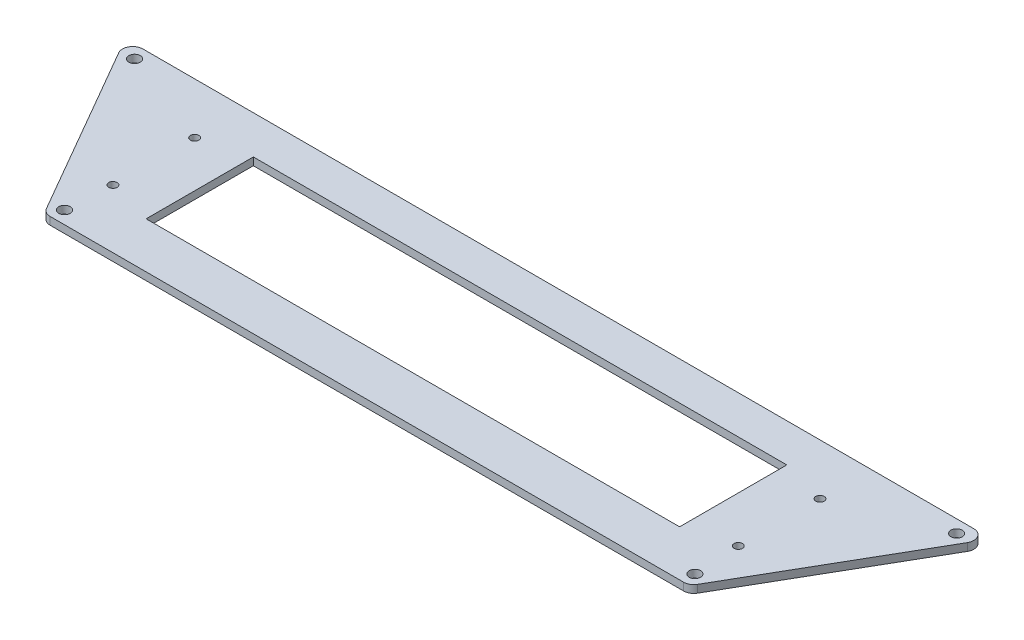
ISO-10303-21;
HEADER;
FILE_DESCRIPTION(('STEP AP214'),'2;1');
FILE_NAME('part.step','',(''),(''),'','','');
FILE_SCHEMA(('AUTOMOTIVE_DESIGN { 1 0 10303 214 1 1 1 1 }'));
ENDSEC;
DATA;
#1=APPLICATION_CONTEXT('core data for automotive mechanical design processes');
#2=APPLICATION_PROTOCOL_DEFINITION('international standard','automotive_design',2000,#1);
#3=PRODUCT_CONTEXT('',#1,'mechanical');
#4=PRODUCT('Part','Part','',(#3));
#5=PRODUCT_RELATED_PRODUCT_CATEGORY('part','',(#4));
#6=PRODUCT_DEFINITION_FORMATION('','',#4);
#7=PRODUCT_DEFINITION_CONTEXT('part definition',#1,'design');
#8=PRODUCT_DEFINITION('design','',#6,#7);
#9=PRODUCT_DEFINITION_SHAPE('','',#8);
#10=(LENGTH_UNIT() NAMED_UNIT(*) SI_UNIT(.MILLI.,.METRE.));
#11=(NAMED_UNIT(*) PLANE_ANGLE_UNIT() SI_UNIT($,.RADIAN.));
#12=(NAMED_UNIT(*) SI_UNIT($,.STERADIAN.) SOLID_ANGLE_UNIT());
#13=UNCERTAINTY_MEASURE_WITH_UNIT(LENGTH_MEASURE(1.E-05),#10,'distance_accuracy_value','');
#14=(GEOMETRIC_REPRESENTATION_CONTEXT(3) GLOBAL_UNCERTAINTY_ASSIGNED_CONTEXT((#13)) GLOBAL_UNIT_ASSIGNED_CONTEXT((#10,
#11,#12)) REPRESENTATION_CONTEXT('',''));
#15=CARTESIAN_POINT('',(0.,0.,0.));
#16=DIRECTION('',(0.,0.,1.));
#17=DIRECTION('',(1.,0.,0.));
#18=AXIS2_PLACEMENT_3D('',#15,#16,#17);
#19=CARTESIAN_POINT('',(-169.68802153517,3.,-36.));
#20=DIRECTION('',(0.,0.,1.));
#21=DIRECTION('',(1.,0.,0.));
#22=AXIS2_PLACEMENT_3D('',#19,#20,#21);
#23=PLANE('',#22);
#24=DIRECTION('',(-1.,0.,0.));
#25=VECTOR('',#24,1.);
#26=CARTESIAN_POINT('',(-169.68802153517,3.,-36.));
#27=LINE('',#26,#25);
#28=CARTESIAN_POINT('',(162.759818304894,3.,-36.));
#29=VERTEX_POINT('',#28);
#30=CARTESIAN_POINT('',(-162.759818304894,3.,-36.));
#31=VERTEX_POINT('',#30);
#32=EDGE_CURVE('E217',#29,#31,#27,.T.);
#33=ORIENTED_EDGE('',*,*,#32,.F.);
#34=DIRECTION('',(0.,-1.,0.));
#35=VECTOR('',#34,1.);
#36=CARTESIAN_POINT('',(162.759818304894,3.,-36.));
#37=LINE('',#36,#35);
#38=CARTESIAN_POINT('',(162.759818304894,0.,-36.));
#39=VERTEX_POINT('',#38);
#40=EDGE_CURVE('E274',#29,#39,#37,.T.);
#41=ORIENTED_EDGE('',*,*,#40,.T.);
#42=DIRECTION('',(-1.,0.,0.));
#43=VECTOR('',#42,1.);
#44=CARTESIAN_POINT('',(-169.68802153517,0.,-36.));
#45=LINE('',#44,#43);
#46=CARTESIAN_POINT('',(-162.759818304894,0.,-36.));
#47=VERTEX_POINT('',#46);
#48=EDGE_CURVE('E216',#39,#47,#45,.T.);
#49=ORIENTED_EDGE('',*,*,#48,.T.);
#50=DIRECTION('',(0.,-1.,0.));
#51=VECTOR('',#50,1.);
#52=CARTESIAN_POINT('',(-162.759818304894,3.,-36.));
#53=LINE('',#52,#51);
#54=EDGE_CURVE('E272',#47,#31,#53,.F.);
#55=ORIENTED_EDGE('',*,*,#54,.T.);
#56=EDGE_LOOP('',(#33,#41,#49,#55));
#57=FACE_BOUND('',#56,.T.);
#58=ADVANCED_FACE('F49',(#57),#23,.F.);
#59=CARTESIAN_POINT('',(-169.68802153517,3.,-36.));
#60=DIRECTION('',(0.86602540378444,0.,-0.499999999999998));
#61=DIRECTION('',(-0.499999999999998,0.,-0.86602540378444));
#62=AXIS2_PLACEMENT_3D('',#59,#60,#61);
#63=PLANE('',#62);
#64=DIRECTION('',(0.499999999999998,0.,0.86602540378444));
#65=VECTOR('',#64,1.);
#66=CARTESIAN_POINT('',(-169.68802153517,3.,-36.));
#67=LINE('',#66,#65);
#68=CARTESIAN_POINT('',(-166.223919920032,3.,-30.));
#69=VERTEX_POINT('',#68);
#70=CARTESIAN_POINT('',(-127.541451884327,3.,37.));
#71=VERTEX_POINT('',#70);
#72=EDGE_CURVE('E220',#69,#71,#67,.T.);
#73=ORIENTED_EDGE('',*,*,#72,.F.);
#74=DIRECTION('',(0.,-1.,0.));
#75=VECTOR('',#74,1.);
#76=CARTESIAN_POINT('',(-166.223919920032,3.,-30.));
#77=LINE('',#76,#75);
#78=CARTESIAN_POINT('',(-166.223919920032,0.,-30.));
#79=VERTEX_POINT('',#78);
#80=EDGE_CURVE('E13',#69,#79,#77,.T.);
#81=ORIENTED_EDGE('',*,*,#80,.T.);
#82=DIRECTION('',(0.499999999999998,0.,0.86602540378444));
#83=VECTOR('',#82,1.);
#84=CARTESIAN_POINT('',(-169.68802153517,0.,-36.));
#85=LINE('',#84,#83);
#86=CARTESIAN_POINT('',(-127.541451884327,0.,37.));
#87=VERTEX_POINT('',#86);
#88=EDGE_CURVE('E233',#79,#87,#85,.T.);
#89=ORIENTED_EDGE('',*,*,#88,.T.);
#90=DIRECTION('',(0.,-1.,0.));
#91=VECTOR('',#90,1.);
#92=CARTESIAN_POINT('',(-127.541451884327,3.,37.));
#93=LINE('',#92,#91);
#94=EDGE_CURVE('E57',#87,#71,#93,.F.);
#95=ORIENTED_EDGE('',*,*,#94,.T.);
#96=EDGE_LOOP('',(#73,#81,#89,#95));
#97=FACE_BOUND('',#96,.T.);
#98=ADVANCED_FACE('F279',(#97),#63,.F.);
#99=CARTESIAN_POINT('',(-126.386751345948,3.,39.));
#100=DIRECTION('',(0.,0.,-1.));
#101=DIRECTION('',(-1.,0.,0.));
#102=AXIS2_PLACEMENT_3D('',#99,#100,#101);
#103=PLANE('',#102);
#104=DIRECTION('',(1.,0.,0.));
#105=VECTOR('',#104,1.);
#106=CARTESIAN_POINT('',(-126.386751345948,0.,39.));
#107=LINE('',#106,#105);
#108=CARTESIAN_POINT('',(-124.07735026919,0.,39.));
#109=VERTEX_POINT('',#108);
#110=CARTESIAN_POINT('',(124.07735026919,0.,39.));
#111=VERTEX_POINT('',#110);
#112=EDGE_CURVE('E236',#109,#111,#107,.T.);
#113=ORIENTED_EDGE('',*,*,#112,.T.);
#114=DIRECTION('',(0.,-1.,0.));
#115=VECTOR('',#114,1.);
#116=CARTESIAN_POINT('',(124.07735026919,3.,39.));
#117=LINE('',#116,#115);
#118=CARTESIAN_POINT('',(124.07735026919,3.,39.));
#119=VERTEX_POINT('',#118);
#120=EDGE_CURVE('E262',#111,#119,#117,.F.);
#121=ORIENTED_EDGE('',*,*,#120,.T.);
#122=DIRECTION('',(1.,0.,0.));
#123=VECTOR('',#122,1.);
#124=CARTESIAN_POINT('',(-126.386751345948,3.,39.));
#125=LINE('',#124,#123);
#126=CARTESIAN_POINT('',(-124.07735026919,3.,39.));
#127=VERTEX_POINT('',#126);
#128=EDGE_CURVE('E224',#127,#119,#125,.T.);
#129=ORIENTED_EDGE('',*,*,#128,.F.);
#130=DIRECTION('',(0.,-1.,0.));
#131=VECTOR('',#130,1.);
#132=CARTESIAN_POINT('',(-124.07735026919,3.,39.));
#133=LINE('',#132,#131);
#134=EDGE_CURVE('E259',#127,#109,#133,.T.);
#135=ORIENTED_EDGE('',*,*,#134,.T.);
#136=EDGE_LOOP('',(#113,#121,#129,#135));
#137=FACE_BOUND('',#136,.T.);
#138=ADVANCED_FACE('F290',(#137),#103,.F.);
#139=CARTESIAN_POINT('',(169.68802153517,3.,-36.));
#140=DIRECTION('',(-0.86602540378444,0.,-0.499999999999998));
#141=DIRECTION('',(-0.499999999999998,0.,0.86602540378444));
#142=AXIS2_PLACEMENT_3D('',#139,#140,#141);
#143=PLANE('',#142);
#144=DIRECTION('',(0.499999999999998,0.,-0.86602540378444));
#145=VECTOR('',#144,1.);
#146=CARTESIAN_POINT('',(169.68802153517,3.,-36.));
#147=LINE('',#146,#145);
#148=CARTESIAN_POINT('',(127.541451884327,3.,37.));
#149=VERTEX_POINT('',#148);
#150=CARTESIAN_POINT('',(166.223919920032,3.,-30.));
#151=VERTEX_POINT('',#150);
#152=EDGE_CURVE('E227',#149,#151,#147,.T.);
#153=ORIENTED_EDGE('',*,*,#152,.F.);
#154=DIRECTION('',(0.,-1.,0.));
#155=VECTOR('',#154,1.);
#156=CARTESIAN_POINT('',(127.541451884327,3.,37.));
#157=LINE('',#156,#155);
#158=CARTESIAN_POINT('',(127.541451884327,0.,37.));
#159=VERTEX_POINT('',#158);
#160=EDGE_CURVE('E248',#149,#159,#157,.T.);
#161=ORIENTED_EDGE('',*,*,#160,.T.);
#162=DIRECTION('',(0.499999999999998,0.,-0.86602540378444));
#163=VECTOR('',#162,1.);
#164=CARTESIAN_POINT('',(169.68802153517,0.,-36.));
#165=LINE('',#164,#163);
#166=CARTESIAN_POINT('',(166.223919920032,0.,-30.));
#167=VERTEX_POINT('',#166);
#168=EDGE_CURVE('E221',#159,#167,#165,.T.);
#169=ORIENTED_EDGE('',*,*,#168,.T.);
#170=DIRECTION('',(0.,-1.,0.));
#171=VECTOR('',#170,1.);
#172=CARTESIAN_POINT('',(166.223919920032,3.,-30.));
#173=LINE('',#172,#171);
#174=EDGE_CURVE('E230',#167,#151,#173,.F.);
#175=ORIENTED_EDGE('',*,*,#174,.T.);
#176=EDGE_LOOP('',(#153,#161,#169,#175));
#177=FACE_BOUND('',#176,.T.);
#178=ADVANCED_FACE('F301',(#177),#143,.F.);
#179=CARTESIAN_POINT('',(0.,3.,0.));
#180=DIRECTION('',(0.,-1.,0.));
#181=DIRECTION('',(0.,0.,-1.));
#182=AXIS2_PLACEMENT_3D('',#179,#180,#181);
#183=PLANE('',#182);
#184=DIRECTION('',(1.,0.,0.));
#185=VECTOR('',#184,1.);
#186=CARTESIAN_POINT('',(-104.5,3.,-21.));
#187=LINE('',#186,#185);
#188=CARTESIAN_POINT('',(-104.5,3.,-21.));
#189=VERTEX_POINT('',#188);
#190=CARTESIAN_POINT('',(104.5,3.,-21.));
#191=VERTEX_POINT('',#190);
#192=EDGE_CURVE('E146',#189,#191,#187,.T.);
#193=ORIENTED_EDGE('',*,*,#192,.T.);
#194=DIRECTION('',(0.,0.,1.));
#195=VECTOR('',#194,1.);
#196=CARTESIAN_POINT('',(104.5,3.,-21.));
#197=LINE('',#196,#195);
#198=CARTESIAN_POINT('',(104.5,3.,21.));
#199=VERTEX_POINT('',#198);
#200=EDGE_CURVE('E140',#191,#199,#197,.T.);
#201=ORIENTED_EDGE('',*,*,#200,.T.);
#202=DIRECTION('',(-1.,0.,0.));
#203=VECTOR('',#202,1.);
#204=CARTESIAN_POINT('',(-104.5,3.,21.));
#205=LINE('',#204,#203);
#206=CARTESIAN_POINT('',(-104.5,3.,21.));
#207=VERTEX_POINT('',#206);
#208=EDGE_CURVE('E149',#199,#207,#205,.T.);
#209=ORIENTED_EDGE('',*,*,#208,.T.);
#210=DIRECTION('',(0.,0.,-1.));
#211=VECTOR('',#210,1.);
#212=CARTESIAN_POINT('',(-104.5,3.,-21.));
#213=LINE('',#212,#211);
#214=EDGE_CURVE('E64',#207,#189,#213,.T.);
#215=ORIENTED_EDGE('',*,*,#214,.T.);
#216=EDGE_LOOP('',(#193,#201,#209,#215));
#217=FACE_BOUND('',#216,.T.);
#218=CARTESIAN_POINT('',(123.5,3.,34.));
#219=DIRECTION('',(0.,-1.,0.));
#220=DIRECTION('',(0.,0.,-1.));
#221=AXIS2_PLACEMENT_3D('',#218,#219,#220);
#222=CIRCLE('',#221,2.24999999999999);
#223=CARTESIAN_POINT('',(123.5,3.,31.75));
#224=VERTEX_POINT('',#223);
#225=EDGE_CURVE('E177',#224,#224,#222,.T.);
#226=ORIENTED_EDGE('',*,*,#225,.T.);
#227=EDGE_LOOP('',(#226));
#228=FACE_BOUND('',#227,.T.);
#229=CARTESIAN_POINT('',(-123.5,3.,34.));
#230=DIRECTION('',(0.,-1.,0.));
#231=DIRECTION('',(0.,0.,-1.));
#232=AXIS2_PLACEMENT_3D('',#229,#230,#231);
#233=CIRCLE('',#232,2.24999999999999);
#234=CARTESIAN_POINT('',(-123.5,3.,31.75));
#235=VERTEX_POINT('',#234);
#236=EDGE_CURVE('E183',#235,#235,#233,.T.);
#237=ORIENTED_EDGE('',*,*,#236,.T.);
#238=EDGE_LOOP('',(#237));
#239=FACE_BOUND('',#238,.T.);
#240=CARTESIAN_POINT('',(-161.027767497325,3.,-31.));
#241=DIRECTION('',(0.,-1.,0.));
#242=DIRECTION('',(0.,0.,-1.));
#243=AXIS2_PLACEMENT_3D('',#240,#241,#242);
#244=CIRCLE('',#243,2.24999999999999);
#245=CARTESIAN_POINT('',(-161.027767497325,3.,-33.25));
#246=VERTEX_POINT('',#245);
#247=EDGE_CURVE('E189',#246,#246,#244,.T.);
#248=ORIENTED_EDGE('',*,*,#247,.T.);
#249=EDGE_LOOP('',(#248));
#250=FACE_BOUND('',#249,.T.);
#251=CARTESIAN_POINT('',(161.027767497325,3.,-31.));
#252=DIRECTION('',(0.,-1.,0.));
#253=DIRECTION('',(0.,0.,-1.));
#254=AXIS2_PLACEMENT_3D('',#251,#252,#253);
#255=CIRCLE('',#254,2.24999999999999);
#256=CARTESIAN_POINT('',(161.027767497325,3.,-33.25));
#257=VERTEX_POINT('',#256);
#258=EDGE_CURVE('E193',#257,#257,#255,.T.);
#259=ORIENTED_EDGE('',*,*,#258,.T.);
#260=EDGE_LOOP('',(#259));
#261=FACE_BOUND('',#260,.T.);
#262=CARTESIAN_POINT('',(122.5,3.,-16.));
#263=DIRECTION('',(0.,1.,0.));
#264=DIRECTION('',(0.,0.,1.));
#265=AXIS2_PLACEMENT_3D('',#262,#263,#264);
#266=CIRCLE('',#265,1.64999999999998);
#267=CARTESIAN_POINT('',(122.5,3.,-14.35));
#268=VERTEX_POINT('',#267);
#269=EDGE_CURVE('E196',#268,#268,#266,.T.);
#270=ORIENTED_EDGE('',*,*,#269,.F.);
#271=EDGE_LOOP('',(#270));
#272=FACE_BOUND('',#271,.T.);
#273=CARTESIAN_POINT('',(-122.5,3.,16.));
#274=DIRECTION('',(0.,1.,0.));
#275=DIRECTION('',(0.,0.,1.));
#276=AXIS2_PLACEMENT_3D('',#273,#274,#275);
#277=CIRCLE('',#276,1.64999999999998);
#278=CARTESIAN_POINT('',(-122.5,3.,17.65));
#279=VERTEX_POINT('',#278);
#280=EDGE_CURVE('E202',#279,#279,#277,.T.);
#281=ORIENTED_EDGE('',*,*,#280,.F.);
#282=EDGE_LOOP('',(#281));
#283=FACE_BOUND('',#282,.T.);
#284=CARTESIAN_POINT('',(-122.5,3.,-16.));
#285=DIRECTION('',(0.,1.,0.));
#286=DIRECTION('',(0.,0.,1.));
#287=AXIS2_PLACEMENT_3D('',#284,#285,#286);
#288=CIRCLE('',#287,1.64999999999998);
#289=CARTESIAN_POINT('',(-122.5,3.,-14.35));
#290=VERTEX_POINT('',#289);
#291=EDGE_CURVE('E206',#290,#290,#288,.T.);
#292=ORIENTED_EDGE('',*,*,#291,.F.);
#293=EDGE_LOOP('',(#292));
#294=FACE_BOUND('',#293,.T.);
#295=CARTESIAN_POINT('',(122.5,3.,16.));
#296=DIRECTION('',(0.,1.,0.));
#297=DIRECTION('',(0.,0.,1.));
#298=AXIS2_PLACEMENT_3D('',#295,#296,#297);
#299=CIRCLE('',#298,1.64999999999998);
#300=CARTESIAN_POINT('',(122.5,3.,17.65));
#301=VERTEX_POINT('',#300);
#302=EDGE_CURVE('E210',#301,#301,#299,.T.);
#303=ORIENTED_EDGE('',*,*,#302,.F.);
#304=EDGE_LOOP('',(#303));
#305=FACE_BOUND('',#304,.T.);
#306=ORIENTED_EDGE('',*,*,#128,.T.);
#307=CARTESIAN_POINT('',(124.07735026919,3.,35.));
#308=DIRECTION('',(0.,-1.,0.));
#309=DIRECTION('',(0.,0.,-1.));
#310=AXIS2_PLACEMENT_3D('',#307,#308,#309);
#311=CIRCLE('',#310,4.);
#312=EDGE_CURVE('E270',#119,#149,#311,.F.);
#313=ORIENTED_EDGE('',*,*,#312,.T.);
#314=ORIENTED_EDGE('',*,*,#152,.T.);
#315=CARTESIAN_POINT('',(162.759818304894,3.,-32.));
#316=DIRECTION('',(0.,-1.,0.));
#317=DIRECTION('',(0.,0.,-1.));
#318=AXIS2_PLACEMENT_3D('',#315,#316,#317);
#319=CIRCLE('',#318,4.);
#320=EDGE_CURVE('E268',#151,#29,#319,.F.);
#321=ORIENTED_EDGE('',*,*,#320,.T.);
#322=ORIENTED_EDGE('',*,*,#32,.T.);
#323=CARTESIAN_POINT('',(-162.759818304894,3.,-32.));
#324=DIRECTION('',(0.,-1.,0.));
#325=DIRECTION('',(0.,0.,-1.));
#326=AXIS2_PLACEMENT_3D('',#323,#324,#325);
#327=CIRCLE('',#326,4.);
#328=EDGE_CURVE('E266',#31,#69,#327,.F.);
#329=ORIENTED_EDGE('',*,*,#328,.T.);
#330=ORIENTED_EDGE('',*,*,#72,.T.);
#331=CARTESIAN_POINT('',(-124.07735026919,3.,35.));
#332=DIRECTION('',(0.,-1.,0.));
#333=DIRECTION('',(0.,0.,-1.));
#334=AXIS2_PLACEMENT_3D('',#331,#332,#333);
#335=CIRCLE('',#334,4.);
#336=EDGE_CURVE('E264',#71,#127,#335,.F.);
#337=ORIENTED_EDGE('',*,*,#336,.T.);
#338=EDGE_LOOP('',(#306,#313,#314,#321,#322,#329,#330,#337));
#339=FACE_BOUND('',#338,.T.);
#340=ADVANCED_FACE('F153',(#217,#228,#239,#250,#261,#272,#283,#294,#305,#339),#183,.F.);
#341=CARTESIAN_POINT('',(0.,0.,0.));
#342=DIRECTION('',(0.,-1.,0.));
#343=DIRECTION('',(0.,0.,-1.));
#344=AXIS2_PLACEMENT_3D('',#341,#342,#343);
#345=PLANE('',#344);
#346=DIRECTION('',(0.,0.,1.));
#347=VECTOR('',#346,1.);
#348=CARTESIAN_POINT('',(104.5,0.,-21.));
#349=LINE('',#348,#347);
#350=CARTESIAN_POINT('',(104.5,0.,-21.));
#351=VERTEX_POINT('',#350);
#352=CARTESIAN_POINT('',(104.5,0.,21.));
#353=VERTEX_POINT('',#352);
#354=EDGE_CURVE('E72',#351,#353,#349,.T.);
#355=ORIENTED_EDGE('',*,*,#354,.F.);
#356=DIRECTION('',(1.,0.,0.));
#357=VECTOR('',#356,1.);
#358=CARTESIAN_POINT('',(-104.5,0.,-21.));
#359=LINE('',#358,#357);
#360=CARTESIAN_POINT('',(-104.5,0.,-21.));
#361=VERTEX_POINT('',#360);
#362=EDGE_CURVE('E156',#361,#351,#359,.T.);
#363=ORIENTED_EDGE('',*,*,#362,.F.);
#364=DIRECTION('',(0.,0.,-1.));
#365=VECTOR('',#364,1.);
#366=CARTESIAN_POINT('',(-104.5,0.,-21.));
#367=LINE('',#366,#365);
#368=CARTESIAN_POINT('',(-104.5,0.,21.));
#369=VERTEX_POINT('',#368);
#370=EDGE_CURVE('E159',#369,#361,#367,.T.);
#371=ORIENTED_EDGE('',*,*,#370,.F.);
#372=DIRECTION('',(-1.,0.,0.));
#373=VECTOR('',#372,1.);
#374=CARTESIAN_POINT('',(-104.5,0.,21.));
#375=LINE('',#374,#373);
#376=EDGE_CURVE('E165',#353,#369,#375,.T.);
#377=ORIENTED_EDGE('',*,*,#376,.F.);
#378=EDGE_LOOP('',(#355,#363,#371,#377));
#379=FACE_BOUND('',#378,.T.);
#380=CARTESIAN_POINT('',(123.5,0.,34.));
#381=DIRECTION('',(0.,-1.,0.));
#382=DIRECTION('',(0.,0.,-1.));
#383=AXIS2_PLACEMENT_3D('',#380,#381,#382);
#384=CIRCLE('',#383,2.25);
#385=CARTESIAN_POINT('',(123.5,0.,31.75));
#386=VERTEX_POINT('',#385);
#387=EDGE_CURVE('E171',#386,#386,#384,.T.);
#388=ORIENTED_EDGE('',*,*,#387,.F.);
#389=EDGE_LOOP('',(#388));
#390=FACE_BOUND('',#389,.T.);
#391=CARTESIAN_POINT('',(-123.5,0.,34.));
#392=DIRECTION('',(0.,-1.,0.));
#393=DIRECTION('',(0.,0.,-1.));
#394=AXIS2_PLACEMENT_3D('',#391,#392,#393);
#395=CIRCLE('',#394,2.24999999999999);
#396=CARTESIAN_POINT('',(-123.5,0.,31.75));
#397=VERTEX_POINT('',#396);
#398=EDGE_CURVE('E180',#397,#397,#395,.T.);
#399=ORIENTED_EDGE('',*,*,#398,.F.);
#400=EDGE_LOOP('',(#399));
#401=FACE_BOUND('',#400,.T.);
#402=CARTESIAN_POINT('',(-161.027767497325,0.,-31.));
#403=DIRECTION('',(0.,-1.,0.));
#404=DIRECTION('',(0.,0.,-1.));
#405=AXIS2_PLACEMENT_3D('',#402,#403,#404);
#406=CIRCLE('',#405,2.25);
#407=CARTESIAN_POINT('',(-161.027767497325,0.,-33.25));
#408=VERTEX_POINT('',#407);
#409=EDGE_CURVE('E186',#408,#408,#406,.T.);
#410=ORIENTED_EDGE('',*,*,#409,.F.);
#411=EDGE_LOOP('',(#410));
#412=FACE_BOUND('',#411,.T.);
#413=CARTESIAN_POINT('',(161.027767497325,0.,-31.));
#414=DIRECTION('',(0.,-1.,0.));
#415=DIRECTION('',(0.,0.,-1.));
#416=AXIS2_PLACEMENT_3D('',#413,#414,#415);
#417=CIRCLE('',#416,2.25);
#418=CARTESIAN_POINT('',(161.027767497325,0.,-33.25));
#419=VERTEX_POINT('',#418);
#420=EDGE_CURVE('E190',#419,#419,#417,.T.);
#421=ORIENTED_EDGE('',*,*,#420,.F.);
#422=EDGE_LOOP('',(#421));
#423=FACE_BOUND('',#422,.T.);
#424=CARTESIAN_POINT('',(122.5,0.,-16.));
#425=DIRECTION('',(0.,-1.,0.));
#426=DIRECTION('',(0.,0.,-1.));
#427=AXIS2_PLACEMENT_3D('',#424,#425,#426);
#428=CIRCLE('',#427,1.64999999999999);
#429=CARTESIAN_POINT('',(122.5,0.,-17.65));
#430=VERTEX_POINT('',#429);
#431=EDGE_CURVE('E199',#430,#430,#428,.T.);
#432=ORIENTED_EDGE('',*,*,#431,.F.);
#433=EDGE_LOOP('',(#432));
#434=FACE_BOUND('',#433,.T.);
#435=CARTESIAN_POINT('',(-122.5,0.,16.));
#436=DIRECTION('',(0.,-1.,0.));
#437=DIRECTION('',(0.,0.,-1.));
#438=AXIS2_PLACEMENT_3D('',#435,#436,#437);
#439=CIRCLE('',#438,1.64999999999999);
#440=CARTESIAN_POINT('',(-122.5,0.,14.35));
#441=VERTEX_POINT('',#440);
#442=EDGE_CURVE('E205',#441,#441,#439,.T.);
#443=ORIENTED_EDGE('',*,*,#442,.F.);
#444=EDGE_LOOP('',(#443));
#445=FACE_BOUND('',#444,.T.);
#446=CARTESIAN_POINT('',(-122.5,0.,-16.));
#447=DIRECTION('',(0.,-1.,0.));
#448=DIRECTION('',(0.,0.,-1.));
#449=AXIS2_PLACEMENT_3D('',#446,#447,#448);
#450=CIRCLE('',#449,1.64999999999999);
#451=CARTESIAN_POINT('',(-122.5,0.,-17.65));
#452=VERTEX_POINT('',#451);
#453=EDGE_CURVE('E209',#452,#452,#450,.T.);
#454=ORIENTED_EDGE('',*,*,#453,.F.);
#455=EDGE_LOOP('',(#454));
#456=FACE_BOUND('',#455,.T.);
#457=CARTESIAN_POINT('',(122.5,0.,16.));
#458=DIRECTION('',(0.,-1.,0.));
#459=DIRECTION('',(0.,0.,-1.));
#460=AXIS2_PLACEMENT_3D('',#457,#458,#459);
#461=CIRCLE('',#460,1.64999999999999);
#462=CARTESIAN_POINT('',(122.5,0.,14.35));
#463=VERTEX_POINT('',#462);
#464=EDGE_CURVE('E213',#463,#463,#461,.T.);
#465=ORIENTED_EDGE('',*,*,#464,.F.);
#466=EDGE_LOOP('',(#465));
#467=FACE_BOUND('',#466,.T.);
#468=ORIENTED_EDGE('',*,*,#168,.F.);
#469=CARTESIAN_POINT('',(124.07735026919,0.,35.));
#470=DIRECTION('',(0.,-1.,0.));
#471=DIRECTION('',(0.,0.,-1.));
#472=AXIS2_PLACEMENT_3D('',#469,#470,#471);
#473=CIRCLE('',#472,4.);
#474=EDGE_CURVE('E257',#159,#111,#473,.T.);
#475=ORIENTED_EDGE('',*,*,#474,.T.);
#476=ORIENTED_EDGE('',*,*,#112,.F.);
#477=CARTESIAN_POINT('',(-124.07735026919,0.,35.));
#478=DIRECTION('',(0.,-1.,0.));
#479=DIRECTION('',(0.,0.,-1.));
#480=AXIS2_PLACEMENT_3D('',#477,#478,#479);
#481=CIRCLE('',#480,4.);
#482=EDGE_CURVE('E251',#109,#87,#481,.T.);
#483=ORIENTED_EDGE('',*,*,#482,.T.);
#484=ORIENTED_EDGE('',*,*,#88,.F.);
#485=CARTESIAN_POINT('',(-162.759818304894,0.,-32.));
#486=DIRECTION('',(0.,-1.,0.));
#487=DIRECTION('',(0.,0.,-1.));
#488=AXIS2_PLACEMENT_3D('',#485,#486,#487);
#489=CIRCLE('',#488,4.);
#490=EDGE_CURVE('E253',#79,#47,#489,.T.);
#491=ORIENTED_EDGE('',*,*,#490,.T.);
#492=ORIENTED_EDGE('',*,*,#48,.F.);
#493=CARTESIAN_POINT('',(162.759818304894,0.,-32.));
#494=DIRECTION('',(0.,-1.,0.));
#495=DIRECTION('',(0.,0.,-1.));
#496=AXIS2_PLACEMENT_3D('',#493,#494,#495);
#497=CIRCLE('',#496,4.);
#498=EDGE_CURVE('E255',#39,#167,#497,.T.);
#499=ORIENTED_EDGE('',*,*,#498,.T.);
#500=EDGE_LOOP('',(#468,#475,#476,#483,#484,#491,#492,#499));
#501=FACE_BOUND('',#500,.T.);
#502=ADVANCED_FACE('F294',(#379,#390,#401,#412,#423,#434,#445,#456,#467,#501),#345,.T.);
#503=CARTESIAN_POINT('',(122.5,3.,16.));
#504=DIRECTION('',(0.,1.,0.));
#505=DIRECTION('',(0.,0.,1.));
#506=AXIS2_PLACEMENT_3D('',#503,#504,#505);
#507=CYLINDRICAL_SURFACE('',#506,1.64999999999999);
#508=ORIENTED_EDGE('',*,*,#464,.T.);
#509=EDGE_LOOP('',(#508));
#510=FACE_BOUND('',#509,.T.);
#511=ORIENTED_EDGE('',*,*,#302,.T.);
#512=EDGE_LOOP('',(#511));
#513=FACE_BOUND('',#512,.T.);
#514=ADVANCED_FACE('F363',(#510,#513),#507,.F.);
#515=CARTESIAN_POINT('',(-122.5,3.,-16.));
#516=DIRECTION('',(0.,1.,0.));
#517=DIRECTION('',(0.,0.,1.));
#518=AXIS2_PLACEMENT_3D('',#515,#516,#517);
#519=CYLINDRICAL_SURFACE('',#518,1.64999999999999);
#520=ORIENTED_EDGE('',*,*,#453,.T.);
#521=EDGE_LOOP('',(#520));
#522=FACE_BOUND('',#521,.T.);
#523=ORIENTED_EDGE('',*,*,#291,.T.);
#524=EDGE_LOOP('',(#523));
#525=FACE_BOUND('',#524,.T.);
#526=ADVANCED_FACE('F359',(#522,#525),#519,.F.);
#527=CARTESIAN_POINT('',(-122.5,3.,16.));
#528=DIRECTION('',(0.,1.,0.));
#529=DIRECTION('',(0.,0.,1.));
#530=AXIS2_PLACEMENT_3D('',#527,#528,#529);
#531=CYLINDRICAL_SURFACE('',#530,1.64999999999999);
#532=ORIENTED_EDGE('',*,*,#442,.T.);
#533=EDGE_LOOP('',(#532));
#534=FACE_BOUND('',#533,.T.);
#535=ORIENTED_EDGE('',*,*,#280,.T.);
#536=EDGE_LOOP('',(#535));
#537=FACE_BOUND('',#536,.T.);
#538=ADVANCED_FACE('F355',(#534,#537),#531,.F.);
#539=CARTESIAN_POINT('',(122.5,3.,-16.));
#540=DIRECTION('',(0.,1.,0.));
#541=DIRECTION('',(0.,0.,1.));
#542=AXIS2_PLACEMENT_3D('',#539,#540,#541);
#543=CYLINDRICAL_SURFACE('',#542,1.64999999999999);
#544=ORIENTED_EDGE('',*,*,#431,.T.);
#545=EDGE_LOOP('',(#544));
#546=FACE_BOUND('',#545,.T.);
#547=ORIENTED_EDGE('',*,*,#269,.T.);
#548=EDGE_LOOP('',(#547));
#549=FACE_BOUND('',#548,.T.);
#550=ADVANCED_FACE('F351',(#546,#549),#543,.F.);
#551=CARTESIAN_POINT('',(161.027767497325,0.,-31.));
#552=DIRECTION('',(0.,-1.,0.));
#553=DIRECTION('',(0.,0.,-1.));
#554=AXIS2_PLACEMENT_3D('',#551,#552,#553);
#555=CYLINDRICAL_SURFACE('',#554,2.24999999999999);
#556=ORIENTED_EDGE('',*,*,#420,.T.);
#557=EDGE_LOOP('',(#556));
#558=FACE_BOUND('',#557,.T.);
#559=ORIENTED_EDGE('',*,*,#258,.F.);
#560=EDGE_LOOP('',(#559));
#561=FACE_BOUND('',#560,.T.);
#562=ADVANCED_FACE('F347',(#558,#561),#555,.F.);
#563=CARTESIAN_POINT('',(-161.027767497325,0.,-31.));
#564=DIRECTION('',(0.,-1.,0.));
#565=DIRECTION('',(0.,0.,-1.));
#566=AXIS2_PLACEMENT_3D('',#563,#564,#565);
#567=CYLINDRICAL_SURFACE('',#566,2.24999999999999);
#568=ORIENTED_EDGE('',*,*,#409,.T.);
#569=EDGE_LOOP('',(#568));
#570=FACE_BOUND('',#569,.T.);
#571=ORIENTED_EDGE('',*,*,#247,.F.);
#572=EDGE_LOOP('',(#571));
#573=FACE_BOUND('',#572,.T.);
#574=ADVANCED_FACE('F338',(#570,#573),#567,.F.);
#575=CARTESIAN_POINT('',(-123.5,0.,34.));
#576=DIRECTION('',(0.,-1.,0.));
#577=DIRECTION('',(0.,0.,-1.));
#578=AXIS2_PLACEMENT_3D('',#575,#576,#577);
#579=CYLINDRICAL_SURFACE('',#578,2.24999999999999);
#580=ORIENTED_EDGE('',*,*,#398,.T.);
#581=EDGE_LOOP('',(#580));
#582=FACE_BOUND('',#581,.T.);
#583=ORIENTED_EDGE('',*,*,#236,.F.);
#584=EDGE_LOOP('',(#583));
#585=FACE_BOUND('',#584,.T.);
#586=ADVANCED_FACE('F332',(#582,#585),#579,.F.);
#587=CARTESIAN_POINT('',(123.5,0.,34.));
#588=DIRECTION('',(0.,-1.,0.));
#589=DIRECTION('',(0.,0.,-1.));
#590=AXIS2_PLACEMENT_3D('',#587,#588,#589);
#591=CYLINDRICAL_SURFACE('',#590,2.24999999999999);
#592=ORIENTED_EDGE('',*,*,#387,.T.);
#593=EDGE_LOOP('',(#592));
#594=FACE_BOUND('',#593,.T.);
#595=ORIENTED_EDGE('',*,*,#225,.F.);
#596=EDGE_LOOP('',(#595));
#597=FACE_BOUND('',#596,.T.);
#598=ADVANCED_FACE('F328',(#594,#597),#591,.F.);
#599=CARTESIAN_POINT('',(124.07735026919,3.,35.));
#600=DIRECTION('',(0.,-1.,0.));
#601=DIRECTION('',(0.,0.,-1.));
#602=AXIS2_PLACEMENT_3D('',#599,#600,#601);
#603=CYLINDRICAL_SURFACE('',#602,4.);
#604=ORIENTED_EDGE('',*,*,#312,.F.);
#605=ORIENTED_EDGE('',*,*,#120,.F.);
#606=ORIENTED_EDGE('',*,*,#474,.F.);
#607=ORIENTED_EDGE('',*,*,#160,.F.);
#608=EDGE_LOOP('',(#604,#605,#606,#607));
#609=FACE_BOUND('',#608,.T.);
#610=ADVANCED_FACE('F298',(#609),#603,.T.);
#611=CARTESIAN_POINT('',(162.759818304894,3.,-32.));
#612=DIRECTION('',(0.,-1.,0.));
#613=DIRECTION('',(0.,0.,-1.));
#614=AXIS2_PLACEMENT_3D('',#611,#612,#613);
#615=CYLINDRICAL_SURFACE('',#614,4.);
#616=ORIENTED_EDGE('',*,*,#320,.F.);
#617=ORIENTED_EDGE('',*,*,#174,.F.);
#618=ORIENTED_EDGE('',*,*,#498,.F.);
#619=ORIENTED_EDGE('',*,*,#40,.F.);
#620=EDGE_LOOP('',(#616,#617,#618,#619));
#621=FACE_BOUND('',#620,.T.);
#622=ADVANCED_FACE('F307',(#621),#615,.T.);
#623=CARTESIAN_POINT('',(-162.759818304894,3.,-32.));
#624=DIRECTION('',(0.,-1.,0.));
#625=DIRECTION('',(0.,0.,-1.));
#626=AXIS2_PLACEMENT_3D('',#623,#624,#625);
#627=CYLINDRICAL_SURFACE('',#626,4.);
#628=ORIENTED_EDGE('',*,*,#328,.F.);
#629=ORIENTED_EDGE('',*,*,#54,.F.);
#630=ORIENTED_EDGE('',*,*,#490,.F.);
#631=ORIENTED_EDGE('',*,*,#80,.F.);
#632=EDGE_LOOP('',(#628,#629,#630,#631));
#633=FACE_BOUND('',#632,.T.);
#634=ADVANCED_FACE('F312',(#633),#627,.T.);
#635=CARTESIAN_POINT('',(-124.07735026919,3.,35.));
#636=DIRECTION('',(0.,-1.,0.));
#637=DIRECTION('',(0.,0.,-1.));
#638=AXIS2_PLACEMENT_3D('',#635,#636,#637);
#639=CYLINDRICAL_SURFACE('',#638,4.);
#640=ORIENTED_EDGE('',*,*,#336,.F.);
#641=ORIENTED_EDGE('',*,*,#94,.F.);
#642=ORIENTED_EDGE('',*,*,#482,.F.);
#643=ORIENTED_EDGE('',*,*,#134,.F.);
#644=EDGE_LOOP('',(#640,#641,#642,#643));
#645=FACE_BOUND('',#644,.T.);
#646=ADVANCED_FACE('F51',(#645),#639,.T.);
#647=CARTESIAN_POINT('',(104.5,3.,-21.));
#648=DIRECTION('',(1.,0.,0.));
#649=DIRECTION('',(0.,0.,-1.));
#650=AXIS2_PLACEMENT_3D('',#647,#648,#649);
#651=PLANE('',#650);
#652=ORIENTED_EDGE('',*,*,#354,.T.);
#653=DIRECTION('',(0.,-1.,0.));
#654=VECTOR('',#653,1.);
#655=CARTESIAN_POINT('',(104.5,3.,21.));
#656=LINE('',#655,#654);
#657=EDGE_CURVE('E136',#199,#353,#656,.T.);
#658=ORIENTED_EDGE('',*,*,#657,.F.);
#659=ORIENTED_EDGE('',*,*,#200,.F.);
#660=DIRECTION('',(0.,-1.,0.));
#661=VECTOR('',#660,1.);
#662=CARTESIAN_POINT('',(104.5,3.,-21.));
#663=LINE('',#662,#661);
#664=EDGE_CURVE('E169',#191,#351,#663,.T.);
#665=ORIENTED_EDGE('',*,*,#664,.T.);
#666=EDGE_LOOP('',(#652,#658,#659,#665));
#667=FACE_BOUND('',#666,.T.);
#668=ADVANCED_FACE('F138',(#667),#651,.F.);
#669=CARTESIAN_POINT('',(-104.5,3.,-21.));
#670=DIRECTION('',(0.,0.,-1.));
#671=DIRECTION('',(-1.,0.,0.));
#672=AXIS2_PLACEMENT_3D('',#669,#670,#671);
#673=PLANE('',#672);
#674=ORIENTED_EDGE('',*,*,#362,.T.);
#675=ORIENTED_EDGE('',*,*,#664,.F.);
#676=ORIENTED_EDGE('',*,*,#192,.F.);
#677=DIRECTION('',(0.,-1.,0.));
#678=VECTOR('',#677,1.);
#679=CARTESIAN_POINT('',(-104.5,3.,-21.));
#680=LINE('',#679,#678);
#681=EDGE_CURVE('E172',#189,#361,#680,.T.);
#682=ORIENTED_EDGE('',*,*,#681,.T.);
#683=EDGE_LOOP('',(#674,#675,#676,#682));
#684=FACE_BOUND('',#683,.T.);
#685=ADVANCED_FACE('F487',(#684),#673,.F.);
#686=CARTESIAN_POINT('',(-104.5,3.,-21.));
#687=DIRECTION('',(-1.,0.,0.));
#688=DIRECTION('',(0.,0.,1.));
#689=AXIS2_PLACEMENT_3D('',#686,#687,#688);
#690=PLANE('',#689);
#691=ORIENTED_EDGE('',*,*,#370,.T.);
#692=ORIENTED_EDGE('',*,*,#681,.F.);
#693=ORIENTED_EDGE('',*,*,#214,.F.);
#694=DIRECTION('',(0.,-1.,0.));
#695=VECTOR('',#694,1.);
#696=CARTESIAN_POINT('',(-104.5,3.,21.));
#697=LINE('',#696,#695);
#698=EDGE_CURVE('E145',#207,#369,#697,.T.);
#699=ORIENTED_EDGE('',*,*,#698,.T.);
#700=EDGE_LOOP('',(#691,#692,#693,#699));
#701=FACE_BOUND('',#700,.T.);
#702=ADVANCED_FACE('F494',(#701),#690,.F.);
#703=CARTESIAN_POINT('',(-104.5,3.,21.));
#704=DIRECTION('',(0.,0.,1.));
#705=DIRECTION('',(1.,0.,0.));
#706=AXIS2_PLACEMENT_3D('',#703,#704,#705);
#707=PLANE('',#706);
#708=ORIENTED_EDGE('',*,*,#376,.T.);
#709=ORIENTED_EDGE('',*,*,#698,.F.);
#710=ORIENTED_EDGE('',*,*,#208,.F.);
#711=ORIENTED_EDGE('',*,*,#657,.T.);
#712=EDGE_LOOP('',(#708,#709,#710,#711));
#713=FACE_BOUND('',#712,.T.);
#714=ADVANCED_FACE('F150',(#713),#707,.F.);
#715=CLOSED_SHELL('',(#58,#98,#138,#178,#340,#502,#514,#526,#538,#550,#562,#574,#586,#598,#610,
#622,#634,#646,#668,#685,#702,#714));
#716=MANIFOLD_SOLID_BREP('B2',#715);
#717=ADVANCED_BREP_SHAPE_REPRESENTATION('',(#18,#716),#14);
#718=SHAPE_DEFINITION_REPRESENTATION(#9,#717);
ENDSEC;
END-ISO-10303-21;
